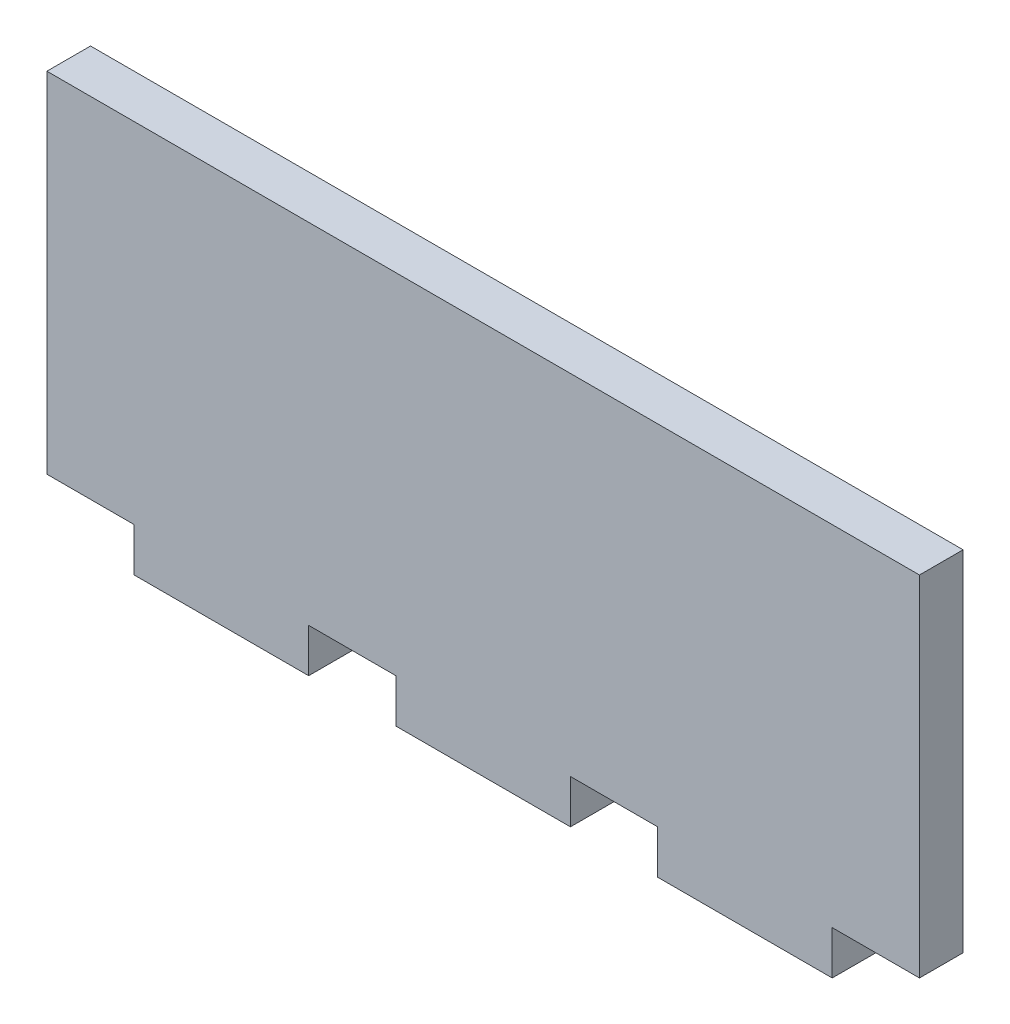
ISO-10303-21;
HEADER;
FILE_DESCRIPTION(('STEP AP214'),'2;1');
FILE_NAME('part.step','',(''),(''),'','','');
FILE_SCHEMA(('AUTOMOTIVE_DESIGN { 1 0 10303 214 1 1 1 1 }'));
ENDSEC;
DATA;
#1=APPLICATION_CONTEXT('core data for automotive mechanical design processes');
#2=APPLICATION_PROTOCOL_DEFINITION('international standard','automotive_design',2000,#1);
#3=PRODUCT_CONTEXT('',#1,'mechanical');
#4=PRODUCT('Part','Part','',(#3));
#5=PRODUCT_RELATED_PRODUCT_CATEGORY('part','',(#4));
#6=PRODUCT_DEFINITION_FORMATION('','',#4);
#7=PRODUCT_DEFINITION_CONTEXT('part definition',#1,'design');
#8=PRODUCT_DEFINITION('design','',#6,#7);
#9=PRODUCT_DEFINITION_SHAPE('','',#8);
#10=(LENGTH_UNIT() NAMED_UNIT(*) SI_UNIT(.MILLI.,.METRE.));
#11=(NAMED_UNIT(*) PLANE_ANGLE_UNIT() SI_UNIT($,.RADIAN.));
#12=(NAMED_UNIT(*) SI_UNIT($,.STERADIAN.) SOLID_ANGLE_UNIT());
#13=UNCERTAINTY_MEASURE_WITH_UNIT(LENGTH_MEASURE(1.E-05),#10,'distance_accuracy_value','');
#14=(GEOMETRIC_REPRESENTATION_CONTEXT(3) GLOBAL_UNCERTAINTY_ASSIGNED_CONTEXT((#13)) GLOBAL_UNIT_ASSIGNED_CONTEXT((#10,
#11,#12)) REPRESENTATION_CONTEXT('',''));
#15=CARTESIAN_POINT('',(0.,0.,0.));
#16=DIRECTION('',(0.,0.,1.));
#17=DIRECTION('',(1.,0.,0.));
#18=AXIS2_PLACEMENT_3D('',#15,#16,#17);
#19=CARTESIAN_POINT('',(-50.,22.5,5.));
#20=DIRECTION('',(1.,0.,0.));
#21=DIRECTION('',(0.,0.,-1.));
#22=AXIS2_PLACEMENT_3D('',#19,#20,#21);
#23=PLANE('',#22);
#24=DIRECTION('',(0.,-1.,0.));
#25=VECTOR('',#24,1.);
#26=CARTESIAN_POINT('',(-50.,22.5,0.));
#27=LINE('',#26,#25);
#28=CARTESIAN_POINT('',(-50.,22.5,0.));
#29=VERTEX_POINT('',#28);
#30=CARTESIAN_POINT('',(-50.,-17.5,0.));
#31=VERTEX_POINT('',#30);
#32=EDGE_CURVE('E177',#29,#31,#27,.T.);
#33=ORIENTED_EDGE('',*,*,#32,.T.);
#34=DIRECTION('',(0.,0.,-1.));
#35=VECTOR('',#34,1.);
#36=CARTESIAN_POINT('',(-50.,-17.5,5.));
#37=LINE('',#36,#35);
#38=CARTESIAN_POINT('',(-50.,-17.5,5.));
#39=VERTEX_POINT('',#38);
#40=EDGE_CURVE('E11',#39,#31,#37,.T.);
#41=ORIENTED_EDGE('',*,*,#40,.F.);
#42=DIRECTION('',(0.,-1.,0.));
#43=VECTOR('',#42,1.);
#44=CARTESIAN_POINT('',(-50.,22.5,5.));
#45=LINE('',#44,#43);
#46=CARTESIAN_POINT('',(-50.,22.5,5.));
#47=VERTEX_POINT('',#46);
#48=EDGE_CURVE('E207',#47,#39,#45,.T.);
#49=ORIENTED_EDGE('',*,*,#48,.F.);
#50=DIRECTION('',(0.,0.,-1.));
#51=VECTOR('',#50,1.);
#52=CARTESIAN_POINT('',(-50.,22.5,5.));
#53=LINE('',#52,#51);
#54=EDGE_CURVE('E173',#47,#29,#53,.T.);
#55=ORIENTED_EDGE('',*,*,#54,.T.);
#56=EDGE_LOOP('',(#33,#41,#49,#55));
#57=FACE_BOUND('',#56,.T.);
#58=ADVANCED_FACE('F33',(#57),#23,.F.);
#59=CARTESIAN_POINT('',(-50.,-17.5,5.));
#60=DIRECTION('',(0.,1.,0.));
#61=DIRECTION('',(0.,0.,1.));
#62=AXIS2_PLACEMENT_3D('',#59,#60,#61);
#63=PLANE('',#62);
#64=DIRECTION('',(1.,0.,0.));
#65=VECTOR('',#64,1.);
#66=CARTESIAN_POINT('',(-50.,-17.5,0.));
#67=LINE('',#66,#65);
#68=CARTESIAN_POINT('',(-40.,-17.5,0.));
#69=VERTEX_POINT('',#68);
#70=EDGE_CURVE('E180',#31,#69,#67,.T.);
#71=ORIENTED_EDGE('',*,*,#70,.T.);
#72=DIRECTION('',(0.,0.,-1.));
#73=VECTOR('',#72,1.);
#74=CARTESIAN_POINT('',(-40.,-17.5,5.));
#75=LINE('',#74,#73);
#76=CARTESIAN_POINT('',(-40.,-17.5,5.));
#77=VERTEX_POINT('',#76);
#78=EDGE_CURVE('E41',#77,#69,#75,.T.);
#79=ORIENTED_EDGE('',*,*,#78,.F.);
#80=DIRECTION('',(1.,0.,0.));
#81=VECTOR('',#80,1.);
#82=CARTESIAN_POINT('',(-50.,-17.5,5.));
#83=LINE('',#82,#81);
#84=EDGE_CURVE('E116',#39,#77,#83,.T.);
#85=ORIENTED_EDGE('',*,*,#84,.F.);
#86=ORIENTED_EDGE('',*,*,#40,.T.);
#87=EDGE_LOOP('',(#71,#79,#85,#86));
#88=FACE_BOUND('',#87,.T.);
#89=ADVANCED_FACE('F305',(#88),#63,.F.);
#90=CARTESIAN_POINT('',(-40.,-22.5,5.));
#91=DIRECTION('',(1.,0.,0.));
#92=DIRECTION('',(0.,0.,-1.));
#93=AXIS2_PLACEMENT_3D('',#90,#91,#92);
#94=PLANE('',#93);
#95=DIRECTION('',(0.,-1.,0.));
#96=VECTOR('',#95,1.);
#97=CARTESIAN_POINT('',(-40.,-22.5,0.));
#98=LINE('',#97,#96);
#99=CARTESIAN_POINT('',(-40.,-22.5,0.));
#100=VERTEX_POINT('',#99);
#101=EDGE_CURVE('E182',#69,#100,#98,.T.);
#102=ORIENTED_EDGE('',*,*,#101,.T.);
#103=DIRECTION('',(0.,0.,-1.));
#104=VECTOR('',#103,1.);
#105=CARTESIAN_POINT('',(-40.,-22.5,5.));
#106=LINE('',#105,#104);
#107=CARTESIAN_POINT('',(-40.,-22.5,5.));
#108=VERTEX_POINT('',#107);
#109=EDGE_CURVE('E238',#108,#100,#106,.T.);
#110=ORIENTED_EDGE('',*,*,#109,.F.);
#111=DIRECTION('',(0.,-1.,0.));
#112=VECTOR('',#111,1.);
#113=CARTESIAN_POINT('',(-40.,-22.5,5.));
#114=LINE('',#113,#112);
#115=EDGE_CURVE('E246',#77,#108,#114,.T.);
#116=ORIENTED_EDGE('',*,*,#115,.F.);
#117=ORIENTED_EDGE('',*,*,#78,.T.);
#118=EDGE_LOOP('',(#102,#110,#116,#117));
#119=FACE_BOUND('',#118,.T.);
#120=ADVANCED_FACE('F244',(#119),#94,.F.);
#121=CARTESIAN_POINT('',(-40.,-22.5,5.));
#122=DIRECTION('',(0.,1.,0.));
#123=DIRECTION('',(0.,0.,1.));
#124=AXIS2_PLACEMENT_3D('',#121,#122,#123);
#125=PLANE('',#124);
#126=DIRECTION('',(1.,0.,0.));
#127=VECTOR('',#126,1.);
#128=CARTESIAN_POINT('',(-40.,-22.5,0.));
#129=LINE('',#128,#127);
#130=CARTESIAN_POINT('',(-20.,-22.5,0.));
#131=VERTEX_POINT('',#130);
#132=EDGE_CURVE('E184',#100,#131,#129,.T.);
#133=ORIENTED_EDGE('',*,*,#132,.T.);
#134=DIRECTION('',(0.,0.,-1.));
#135=VECTOR('',#134,1.);
#136=CARTESIAN_POINT('',(-20.,-22.5,5.));
#137=LINE('',#136,#135);
#138=CARTESIAN_POINT('',(-20.,-22.5,5.));
#139=VERTEX_POINT('',#138);
#140=EDGE_CURVE('E235',#139,#131,#137,.T.);
#141=ORIENTED_EDGE('',*,*,#140,.F.);
#142=DIRECTION('',(1.,0.,0.));
#143=VECTOR('',#142,1.);
#144=CARTESIAN_POINT('',(-40.,-22.5,5.));
#145=LINE('',#144,#143);
#146=EDGE_CURVE('E264',#108,#139,#145,.T.);
#147=ORIENTED_EDGE('',*,*,#146,.F.);
#148=ORIENTED_EDGE('',*,*,#109,.T.);
#149=EDGE_LOOP('',(#133,#141,#147,#148));
#150=FACE_BOUND('',#149,.T.);
#151=ADVANCED_FACE('F255',(#150),#125,.F.);
#152=CARTESIAN_POINT('',(-20.,-22.5,5.));
#153=DIRECTION('',(-1.,0.,0.));
#154=DIRECTION('',(0.,0.,1.));
#155=AXIS2_PLACEMENT_3D('',#152,#153,#154);
#156=PLANE('',#155);
#157=DIRECTION('',(0.,1.,0.));
#158=VECTOR('',#157,1.);
#159=CARTESIAN_POINT('',(-20.,-22.5,0.));
#160=LINE('',#159,#158);
#161=CARTESIAN_POINT('',(-20.,-17.5,0.));
#162=VERTEX_POINT('',#161);
#163=EDGE_CURVE('E186',#131,#162,#160,.T.);
#164=ORIENTED_EDGE('',*,*,#163,.T.);
#165=DIRECTION('',(0.,0.,-1.));
#166=VECTOR('',#165,1.);
#167=CARTESIAN_POINT('',(-20.,-17.5,5.));
#168=LINE('',#167,#166);
#169=CARTESIAN_POINT('',(-20.,-17.5,5.));
#170=VERTEX_POINT('',#169);
#171=EDGE_CURVE('E232',#170,#162,#168,.T.);
#172=ORIENTED_EDGE('',*,*,#171,.F.);
#173=DIRECTION('',(0.,1.,0.));
#174=VECTOR('',#173,1.);
#175=CARTESIAN_POINT('',(-20.,-22.5,5.));
#176=LINE('',#175,#174);
#177=EDGE_CURVE('E261',#139,#170,#176,.T.);
#178=ORIENTED_EDGE('',*,*,#177,.F.);
#179=ORIENTED_EDGE('',*,*,#140,.T.);
#180=EDGE_LOOP('',(#164,#172,#178,#179));
#181=FACE_BOUND('',#180,.T.);
#182=ADVANCED_FACE('F259',(#181),#156,.F.);
#183=CARTESIAN_POINT('',(-10.,-17.5,5.));
#184=DIRECTION('',(0.,1.,0.));
#185=DIRECTION('',(-1.,0.,0.));
#186=AXIS2_PLACEMENT_3D('',#183,#184,#185);
#187=PLANE('',#186);
#188=DIRECTION('',(1.,0.,0.));
#189=VECTOR('',#188,1.);
#190=CARTESIAN_POINT('',(-10.,-17.5,0.));
#191=LINE('',#190,#189);
#192=CARTESIAN_POINT('',(-10.,-17.5,0.));
#193=VERTEX_POINT('',#192);
#194=EDGE_CURVE('E188',#162,#193,#191,.T.);
#195=ORIENTED_EDGE('',*,*,#194,.T.);
#196=DIRECTION('',(0.,0.,-1.));
#197=VECTOR('',#196,1.);
#198=CARTESIAN_POINT('',(-10.,-17.5,5.));
#199=LINE('',#198,#197);
#200=CARTESIAN_POINT('',(-10.,-17.5,5.));
#201=VERTEX_POINT('',#200);
#202=EDGE_CURVE('E229',#201,#193,#199,.T.);
#203=ORIENTED_EDGE('',*,*,#202,.F.);
#204=DIRECTION('',(1.,0.,0.));
#205=VECTOR('',#204,1.);
#206=CARTESIAN_POINT('',(-10.,-17.5,5.));
#207=LINE('',#206,#205);
#208=EDGE_CURVE('E263',#170,#201,#207,.T.);
#209=ORIENTED_EDGE('',*,*,#208,.F.);
#210=ORIENTED_EDGE('',*,*,#171,.T.);
#211=EDGE_LOOP('',(#195,#203,#209,#210));
#212=FACE_BOUND('',#211,.T.);
#213=ADVANCED_FACE('F318',(#212),#187,.F.);
#214=CARTESIAN_POINT('',(-10.,-22.5,5.));
#215=DIRECTION('',(1.,0.,0.));
#216=DIRECTION('',(0.,1.,0.));
#217=AXIS2_PLACEMENT_3D('',#214,#215,#216);
#218=PLANE('',#217);
#219=DIRECTION('',(0.,-1.,0.));
#220=VECTOR('',#219,1.);
#221=CARTESIAN_POINT('',(-10.,-22.5,0.));
#222=LINE('',#221,#220);
#223=CARTESIAN_POINT('',(-10.,-22.5,0.));
#224=VERTEX_POINT('',#223);
#225=EDGE_CURVE('E190',#193,#224,#222,.T.);
#226=ORIENTED_EDGE('',*,*,#225,.T.);
#227=DIRECTION('',(0.,0.,-1.));
#228=VECTOR('',#227,1.);
#229=CARTESIAN_POINT('',(-10.,-22.5,5.));
#230=LINE('',#229,#228);
#231=CARTESIAN_POINT('',(-10.,-22.5,5.));
#232=VERTEX_POINT('',#231);
#233=EDGE_CURVE('E226',#232,#224,#230,.T.);
#234=ORIENTED_EDGE('',*,*,#233,.F.);
#235=DIRECTION('',(0.,-1.,0.));
#236=VECTOR('',#235,1.);
#237=CARTESIAN_POINT('',(-10.,-22.5,5.));
#238=LINE('',#237,#236);
#239=EDGE_CURVE('E266',#201,#232,#238,.T.);
#240=ORIENTED_EDGE('',*,*,#239,.F.);
#241=ORIENTED_EDGE('',*,*,#202,.T.);
#242=EDGE_LOOP('',(#226,#234,#240,#241));
#243=FACE_BOUND('',#242,.T.);
#244=ADVANCED_FACE('F321',(#243),#218,.F.);
#245=CARTESIAN_POINT('',(-10.,-22.5,5.));
#246=DIRECTION('',(0.,1.,0.));
#247=DIRECTION('',(-1.,0.,0.));
#248=AXIS2_PLACEMENT_3D('',#245,#246,#247);
#249=PLANE('',#248);
#250=DIRECTION('',(1.,0.,0.));
#251=VECTOR('',#250,1.);
#252=CARTESIAN_POINT('',(-10.,-22.5,0.));
#253=LINE('',#252,#251);
#254=CARTESIAN_POINT('',(10.,-22.5,0.));
#255=VERTEX_POINT('',#254);
#256=EDGE_CURVE('E192',#224,#255,#253,.T.);
#257=ORIENTED_EDGE('',*,*,#256,.T.);
#258=DIRECTION('',(0.,0.,-1.));
#259=VECTOR('',#258,1.);
#260=CARTESIAN_POINT('',(10.,-22.5,5.));
#261=LINE('',#260,#259);
#262=CARTESIAN_POINT('',(10.,-22.5,5.));
#263=VERTEX_POINT('',#262);
#264=EDGE_CURVE('E223',#263,#255,#261,.T.);
#265=ORIENTED_EDGE('',*,*,#264,.F.);
#266=DIRECTION('',(1.,0.,0.));
#267=VECTOR('',#266,1.);
#268=CARTESIAN_POINT('',(-10.,-22.5,5.));
#269=LINE('',#268,#267);
#270=EDGE_CURVE('E272',#232,#263,#269,.T.);
#271=ORIENTED_EDGE('',*,*,#270,.F.);
#272=ORIENTED_EDGE('',*,*,#233,.T.);
#273=EDGE_LOOP('',(#257,#265,#271,#272));
#274=FACE_BOUND('',#273,.T.);
#275=ADVANCED_FACE('F325',(#274),#249,.F.);
#276=CARTESIAN_POINT('',(10.,-22.5,5.));
#277=DIRECTION('',(-1.,0.,0.));
#278=DIRECTION('',(0.,-1.,0.));
#279=AXIS2_PLACEMENT_3D('',#276,#277,#278);
#280=PLANE('',#279);
#281=DIRECTION('',(0.,1.,0.));
#282=VECTOR('',#281,1.);
#283=CARTESIAN_POINT('',(10.,-22.5,0.));
#284=LINE('',#283,#282);
#285=CARTESIAN_POINT('',(10.,-17.5,0.));
#286=VERTEX_POINT('',#285);
#287=EDGE_CURVE('E194',#255,#286,#284,.T.);
#288=ORIENTED_EDGE('',*,*,#287,.T.);
#289=DIRECTION('',(0.,0.,-1.));
#290=VECTOR('',#289,1.);
#291=CARTESIAN_POINT('',(10.,-17.5,5.));
#292=LINE('',#291,#290);
#293=CARTESIAN_POINT('',(10.,-17.5,5.));
#294=VERTEX_POINT('',#293);
#295=EDGE_CURVE('E220',#294,#286,#292,.T.);
#296=ORIENTED_EDGE('',*,*,#295,.F.);
#297=DIRECTION('',(0.,1.,0.));
#298=VECTOR('',#297,1.);
#299=CARTESIAN_POINT('',(10.,-22.5,5.));
#300=LINE('',#299,#298);
#301=EDGE_CURVE('E274',#263,#294,#300,.T.);
#302=ORIENTED_EDGE('',*,*,#301,.F.);
#303=ORIENTED_EDGE('',*,*,#264,.T.);
#304=EDGE_LOOP('',(#288,#296,#302,#303));
#305=FACE_BOUND('',#304,.T.);
#306=ADVANCED_FACE('F329',(#305),#280,.F.);
#307=CARTESIAN_POINT('',(10.,-17.5,5.));
#308=DIRECTION('',(0.,1.,0.));
#309=DIRECTION('',(-1.,0.,0.));
#310=AXIS2_PLACEMENT_3D('',#307,#308,#309);
#311=PLANE('',#310);
#312=DIRECTION('',(1.,0.,0.));
#313=VECTOR('',#312,1.);
#314=CARTESIAN_POINT('',(10.,-17.5,0.));
#315=LINE('',#314,#313);
#316=CARTESIAN_POINT('',(20.,-17.5,0.));
#317=VERTEX_POINT('',#316);
#318=EDGE_CURVE('E196',#286,#317,#315,.T.);
#319=ORIENTED_EDGE('',*,*,#318,.T.);
#320=DIRECTION('',(0.,0.,-1.));
#321=VECTOR('',#320,1.);
#322=CARTESIAN_POINT('',(20.,-17.5,5.));
#323=LINE('',#322,#321);
#324=CARTESIAN_POINT('',(20.,-17.5,5.));
#325=VERTEX_POINT('',#324);
#326=EDGE_CURVE('E217',#325,#317,#323,.T.);
#327=ORIENTED_EDGE('',*,*,#326,.F.);
#328=DIRECTION('',(1.,0.,0.));
#329=VECTOR('',#328,1.);
#330=CARTESIAN_POINT('',(10.,-17.5,5.));
#331=LINE('',#330,#329);
#332=EDGE_CURVE('E276',#294,#325,#331,.T.);
#333=ORIENTED_EDGE('',*,*,#332,.F.);
#334=ORIENTED_EDGE('',*,*,#295,.T.);
#335=EDGE_LOOP('',(#319,#327,#333,#334));
#336=FACE_BOUND('',#335,.T.);
#337=ADVANCED_FACE('F333',(#336),#311,.F.);
#338=CARTESIAN_POINT('',(20.,-22.5,5.));
#339=DIRECTION('',(1.,0.,0.));
#340=DIRECTION('',(0.,0.,-1.));
#341=AXIS2_PLACEMENT_3D('',#338,#339,#340);
#342=PLANE('',#341);
#343=DIRECTION('',(0.,-1.,0.));
#344=VECTOR('',#343,1.);
#345=CARTESIAN_POINT('',(20.,-22.5,0.));
#346=LINE('',#345,#344);
#347=CARTESIAN_POINT('',(20.,-22.5,0.));
#348=VERTEX_POINT('',#347);
#349=EDGE_CURVE('E198',#317,#348,#346,.T.);
#350=ORIENTED_EDGE('',*,*,#349,.T.);
#351=DIRECTION('',(0.,0.,-1.));
#352=VECTOR('',#351,1.);
#353=CARTESIAN_POINT('',(20.,-22.5,5.));
#354=LINE('',#353,#352);
#355=CARTESIAN_POINT('',(20.,-22.5,5.));
#356=VERTEX_POINT('',#355);
#357=EDGE_CURVE('E214',#356,#348,#354,.T.);
#358=ORIENTED_EDGE('',*,*,#357,.F.);
#359=DIRECTION('',(0.,-1.,0.));
#360=VECTOR('',#359,1.);
#361=CARTESIAN_POINT('',(20.,-22.5,5.));
#362=LINE('',#361,#360);
#363=EDGE_CURVE('E278',#325,#356,#362,.T.);
#364=ORIENTED_EDGE('',*,*,#363,.F.);
#365=ORIENTED_EDGE('',*,*,#326,.T.);
#366=EDGE_LOOP('',(#350,#358,#364,#365));
#367=FACE_BOUND('',#366,.T.);
#368=ADVANCED_FACE('F337',(#367),#342,.F.);
#369=CARTESIAN_POINT('',(20.,-22.5,5.));
#370=DIRECTION('',(0.,1.,0.));
#371=DIRECTION('',(0.,0.,1.));
#372=AXIS2_PLACEMENT_3D('',#369,#370,#371);
#373=PLANE('',#372);
#374=DIRECTION('',(1.,0.,0.));
#375=VECTOR('',#374,1.);
#376=CARTESIAN_POINT('',(20.,-22.5,0.));
#377=LINE('',#376,#375);
#378=CARTESIAN_POINT('',(40.,-22.5,0.));
#379=VERTEX_POINT('',#378);
#380=EDGE_CURVE('E200',#348,#379,#377,.T.);
#381=ORIENTED_EDGE('',*,*,#380,.T.);
#382=DIRECTION('',(0.,0.,-1.));
#383=VECTOR('',#382,1.);
#384=CARTESIAN_POINT('',(40.,-22.5,5.));
#385=LINE('',#384,#383);
#386=CARTESIAN_POINT('',(40.,-22.5,5.));
#387=VERTEX_POINT('',#386);
#388=EDGE_CURVE('E211',#387,#379,#385,.T.);
#389=ORIENTED_EDGE('',*,*,#388,.F.);
#390=DIRECTION('',(1.,0.,0.));
#391=VECTOR('',#390,1.);
#392=CARTESIAN_POINT('',(20.,-22.5,5.));
#393=LINE('',#392,#391);
#394=EDGE_CURVE('E280',#356,#387,#393,.T.);
#395=ORIENTED_EDGE('',*,*,#394,.F.);
#396=ORIENTED_EDGE('',*,*,#357,.T.);
#397=EDGE_LOOP('',(#381,#389,#395,#396));
#398=FACE_BOUND('',#397,.T.);
#399=ADVANCED_FACE('F286',(#398),#373,.F.);
#400=CARTESIAN_POINT('',(40.,-22.5,5.));
#401=DIRECTION('',(-1.,0.,0.));
#402=DIRECTION('',(0.,0.,1.));
#403=AXIS2_PLACEMENT_3D('',#400,#401,#402);
#404=PLANE('',#403);
#405=DIRECTION('',(0.,1.,0.));
#406=VECTOR('',#405,1.);
#407=CARTESIAN_POINT('',(40.,-22.5,0.));
#408=LINE('',#407,#406);
#409=CARTESIAN_POINT('',(40.,-17.5,0.));
#410=VERTEX_POINT('',#409);
#411=EDGE_CURVE('E202',#379,#410,#408,.T.);
#412=ORIENTED_EDGE('',*,*,#411,.T.);
#413=DIRECTION('',(0.,0.,-1.));
#414=VECTOR('',#413,1.);
#415=CARTESIAN_POINT('',(40.,-17.5,5.));
#416=LINE('',#415,#414);
#417=CARTESIAN_POINT('',(40.,-17.5,5.));
#418=VERTEX_POINT('',#417);
#419=EDGE_CURVE('E168',#418,#410,#416,.T.);
#420=ORIENTED_EDGE('',*,*,#419,.F.);
#421=DIRECTION('',(0.,1.,0.));
#422=VECTOR('',#421,1.);
#423=CARTESIAN_POINT('',(40.,-22.5,5.));
#424=LINE('',#423,#422);
#425=EDGE_CURVE('E159',#387,#418,#424,.T.);
#426=ORIENTED_EDGE('',*,*,#425,.F.);
#427=ORIENTED_EDGE('',*,*,#388,.T.);
#428=EDGE_LOOP('',(#412,#420,#426,#427));
#429=FACE_BOUND('',#428,.T.);
#430=ADVANCED_FACE('F290',(#429),#404,.F.);
#431=CARTESIAN_POINT('',(50.,-17.5,5.));
#432=DIRECTION('',(0.,1.,0.));
#433=DIRECTION('',(0.,0.,1.));
#434=AXIS2_PLACEMENT_3D('',#431,#432,#433);
#435=PLANE('',#434);
#436=DIRECTION('',(1.,0.,0.));
#437=VECTOR('',#436,1.);
#438=CARTESIAN_POINT('',(50.,-17.5,0.));
#439=LINE('',#438,#437);
#440=CARTESIAN_POINT('',(50.,-17.5,0.));
#441=VERTEX_POINT('',#440);
#442=EDGE_CURVE('E167',#410,#441,#439,.T.);
#443=ORIENTED_EDGE('',*,*,#442,.T.);
#444=DIRECTION('',(0.,0.,-1.));
#445=VECTOR('',#444,1.);
#446=CARTESIAN_POINT('',(50.,-17.5,5.));
#447=LINE('',#446,#445);
#448=CARTESIAN_POINT('',(50.,-17.5,5.));
#449=VERTEX_POINT('',#448);
#450=EDGE_CURVE('E164',#449,#441,#447,.T.);
#451=ORIENTED_EDGE('',*,*,#450,.F.);
#452=DIRECTION('',(1.,0.,0.));
#453=VECTOR('',#452,1.);
#454=CARTESIAN_POINT('',(50.,-17.5,5.));
#455=LINE('',#454,#453);
#456=EDGE_CURVE('E153',#418,#449,#455,.T.);
#457=ORIENTED_EDGE('',*,*,#456,.F.);
#458=ORIENTED_EDGE('',*,*,#419,.T.);
#459=EDGE_LOOP('',(#443,#451,#457,#458));
#460=FACE_BOUND('',#459,.T.);
#461=ADVANCED_FACE('F165',(#460),#435,.F.);
#462=CARTESIAN_POINT('',(50.,22.5,5.));
#463=DIRECTION('',(-1.,0.,0.));
#464=DIRECTION('',(0.,0.,1.));
#465=AXIS2_PLACEMENT_3D('',#462,#463,#464);
#466=PLANE('',#465);
#467=DIRECTION('',(0.,1.,0.));
#468=VECTOR('',#467,1.);
#469=CARTESIAN_POINT('',(50.,22.5,0.));
#470=LINE('',#469,#468);
#471=CARTESIAN_POINT('',(50.,22.5,0.));
#472=VERTEX_POINT('',#471);
#473=EDGE_CURVE('E102',#441,#472,#470,.T.);
#474=ORIENTED_EDGE('',*,*,#473,.T.);
#475=DIRECTION('',(0.,0.,-1.));
#476=VECTOR('',#475,1.);
#477=CARTESIAN_POINT('',(50.,22.5,5.));
#478=LINE('',#477,#476);
#479=CARTESIAN_POINT('',(50.,22.5,5.));
#480=VERTEX_POINT('',#479);
#481=EDGE_CURVE('E169',#480,#472,#478,.T.);
#482=ORIENTED_EDGE('',*,*,#481,.F.);
#483=DIRECTION('',(0.,1.,0.));
#484=VECTOR('',#483,1.);
#485=CARTESIAN_POINT('',(50.,22.5,5.));
#486=LINE('',#485,#484);
#487=EDGE_CURVE('E157',#449,#480,#486,.T.);
#488=ORIENTED_EDGE('',*,*,#487,.F.);
#489=ORIENTED_EDGE('',*,*,#450,.T.);
#490=EDGE_LOOP('',(#474,#482,#488,#489));
#491=FACE_BOUND('',#490,.T.);
#492=ADVANCED_FACE('F171',(#491),#466,.F.);
#493=CARTESIAN_POINT('',(-50.,22.5,5.));
#494=DIRECTION('',(0.,-1.,0.));
#495=DIRECTION('',(0.,0.,-1.));
#496=AXIS2_PLACEMENT_3D('',#493,#494,#495);
#497=PLANE('',#496);
#498=DIRECTION('',(-1.,0.,0.));
#499=VECTOR('',#498,1.);
#500=CARTESIAN_POINT('',(-50.,22.5,0.));
#501=LINE('',#500,#499);
#502=EDGE_CURVE('E108',#472,#29,#501,.T.);
#503=ORIENTED_EDGE('',*,*,#502,.T.);
#504=ORIENTED_EDGE('',*,*,#54,.F.);
#505=DIRECTION('',(-1.,0.,0.));
#506=VECTOR('',#505,1.);
#507=CARTESIAN_POINT('',(-50.,22.5,5.));
#508=LINE('',#507,#506);
#509=EDGE_CURVE('E49',#480,#47,#508,.T.);
#510=ORIENTED_EDGE('',*,*,#509,.F.);
#511=ORIENTED_EDGE('',*,*,#481,.T.);
#512=EDGE_LOOP('',(#503,#504,#510,#511));
#513=FACE_BOUND('',#512,.T.);
#514=ADVANCED_FACE('F294',(#513),#497,.F.);
#515=CARTESIAN_POINT('',(0.,0.,5.));
#516=DIRECTION('',(0.,0.,1.));
#517=DIRECTION('',(1.,0.,0.));
#518=AXIS2_PLACEMENT_3D('',#515,#516,#517);
#519=PLANE('',#518);
#520=ORIENTED_EDGE('',*,*,#48,.T.);
#521=ORIENTED_EDGE('',*,*,#84,.T.);
#522=ORIENTED_EDGE('',*,*,#115,.T.);
#523=ORIENTED_EDGE('',*,*,#146,.T.);
#524=ORIENTED_EDGE('',*,*,#177,.T.);
#525=ORIENTED_EDGE('',*,*,#208,.T.);
#526=ORIENTED_EDGE('',*,*,#239,.T.);
#527=ORIENTED_EDGE('',*,*,#270,.T.);
#528=ORIENTED_EDGE('',*,*,#301,.T.);
#529=ORIENTED_EDGE('',*,*,#332,.T.);
#530=ORIENTED_EDGE('',*,*,#363,.T.);
#531=ORIENTED_EDGE('',*,*,#394,.T.);
#532=ORIENTED_EDGE('',*,*,#425,.T.);
#533=ORIENTED_EDGE('',*,*,#456,.T.);
#534=ORIENTED_EDGE('',*,*,#487,.T.);
#535=ORIENTED_EDGE('',*,*,#509,.T.);
#536=EDGE_LOOP('',(#520,#521,#522,#523,#524,#525,#526,#527,#528,#529,#530,#531,#532,#533,#534,#535));
#537=FACE_BOUND('',#536,.T.);
#538=ADVANCED_FACE('F155',(#537),#519,.T.);
#539=CARTESIAN_POINT('',(0.,0.,0.));
#540=DIRECTION('',(0.,0.,1.));
#541=DIRECTION('',(1.,0.,0.));
#542=AXIS2_PLACEMENT_3D('',#539,#540,#541);
#543=PLANE('',#542);
#544=ORIENTED_EDGE('',*,*,#32,.F.);
#545=ORIENTED_EDGE('',*,*,#502,.F.);
#546=ORIENTED_EDGE('',*,*,#473,.F.);
#547=ORIENTED_EDGE('',*,*,#442,.F.);
#548=ORIENTED_EDGE('',*,*,#411,.F.);
#549=ORIENTED_EDGE('',*,*,#380,.F.);
#550=ORIENTED_EDGE('',*,*,#349,.F.);
#551=ORIENTED_EDGE('',*,*,#318,.F.);
#552=ORIENTED_EDGE('',*,*,#287,.F.);
#553=ORIENTED_EDGE('',*,*,#256,.F.);
#554=ORIENTED_EDGE('',*,*,#225,.F.);
#555=ORIENTED_EDGE('',*,*,#194,.F.);
#556=ORIENTED_EDGE('',*,*,#163,.F.);
#557=ORIENTED_EDGE('',*,*,#132,.F.);
#558=ORIENTED_EDGE('',*,*,#101,.F.);
#559=ORIENTED_EDGE('',*,*,#70,.F.);
#560=EDGE_LOOP('',(#544,#545,#546,#547,#548,#549,#550,#551,#552,#553,#554,#555,#556,#557,#558,#559));
#561=FACE_BOUND('',#560,.T.);
#562=ADVANCED_FACE('F250',(#561),#543,.F.);
#563=CLOSED_SHELL('',(#58,#89,#120,#151,#182,#213,#244,#275,#306,#337,#368,#399,#430,#461,#492,
#514,#538,#562));
#564=MANIFOLD_SOLID_BREP('B2',#563);
#565=ADVANCED_BREP_SHAPE_REPRESENTATION('',(#18,#564),#14);
#566=SHAPE_DEFINITION_REPRESENTATION(#9,#565);
ENDSEC;
END-ISO-10303-21;
